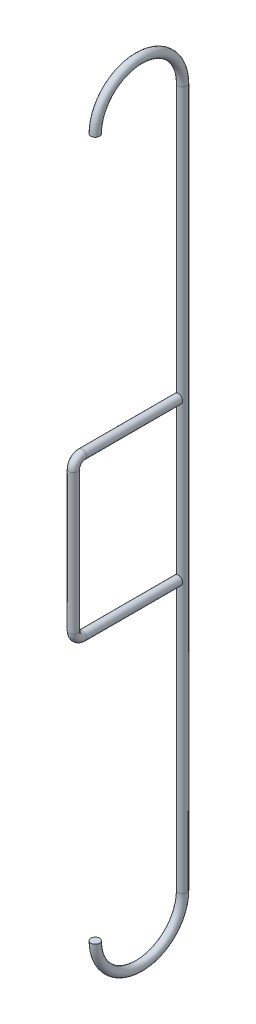
ISO-10303-21;
HEADER;
FILE_DESCRIPTION(('STEP AP214'),'2;1');
FILE_NAME('part.step','',(''),(''),'','','');
FILE_SCHEMA(('AUTOMOTIVE_DESIGN { 1 0 10303 214 1 1 1 1 }'));
ENDSEC;
DATA;
#1=APPLICATION_CONTEXT('core data for automotive mechanical design processes');
#2=APPLICATION_PROTOCOL_DEFINITION('international standard','automotive_design',2000,#1);
#3=PRODUCT_CONTEXT('',#1,'mechanical');
#4=PRODUCT('Part','Part','',(#3));
#5=PRODUCT_RELATED_PRODUCT_CATEGORY('part','',(#4));
#6=PRODUCT_DEFINITION_FORMATION('','',#4);
#7=PRODUCT_DEFINITION_CONTEXT('part definition',#1,'design');
#8=PRODUCT_DEFINITION('design','',#6,#7);
#9=PRODUCT_DEFINITION_SHAPE('','',#8);
#10=(LENGTH_UNIT() NAMED_UNIT(*) SI_UNIT(.MILLI.,.METRE.));
#11=(NAMED_UNIT(*) PLANE_ANGLE_UNIT() SI_UNIT($,.RADIAN.));
#12=(NAMED_UNIT(*) SI_UNIT($,.STERADIAN.) SOLID_ANGLE_UNIT());
#13=UNCERTAINTY_MEASURE_WITH_UNIT(LENGTH_MEASURE(1.E-05),#10,'distance_accuracy_value','');
#14=(GEOMETRIC_REPRESENTATION_CONTEXT(3) GLOBAL_UNCERTAINTY_ASSIGNED_CONTEXT((#13)) GLOBAL_UNIT_ASSIGNED_CONTEXT((#10,
#11,#12)) REPRESENTATION_CONTEXT('',''));
#15=CARTESIAN_POINT('',(0.,0.,0.));
#16=DIRECTION('',(0.,0.,1.));
#17=DIRECTION('',(1.,0.,0.));
#18=AXIS2_PLACEMENT_3D('',#15,#16,#17);
#19=CARTESIAN_POINT('',(0.,-57.15,-28.575));
#20=DIRECTION('',(0.,0.,-1.));
#21=DIRECTION('',(1.,0.,0.));
#22=AXIS2_PLACEMENT_3D('',#19,#20,#21);
#23=PLANE('',#22);
#24=CARTESIAN_POINT('',(0.,-57.15,-28.575));
#25=DIRECTION('',(0.,0.,-1.));
#26=DIRECTION('',(1.,0.,0.));
#27=AXIS2_PLACEMENT_3D('',#24,#25,#26);
#28=CIRCLE('',#27,3.175);
#29=CARTESIAN_POINT('',(3.175,-57.15,-28.575));
#30=VERTEX_POINT('',#29);
#31=EDGE_CURVE('E64',#30,#30,#28,.T.);
#32=ORIENTED_EDGE('',*,*,#31,.T.);
#33=EDGE_LOOP('',(#32));
#34=FACE_BOUND('',#33,.T.);
#35=ADVANCED_FACE('F42',(#34),#23,.T.);
#36=CARTESIAN_POINT('',(0.,57.15,-28.575));
#37=DIRECTION('',(0.,0.,1.));
#38=DIRECTION('',(1.,0.,0.));
#39=AXIS2_PLACEMENT_3D('',#36,#37,#38);
#40=PLANE('',#39);
#41=CARTESIAN_POINT('',(0.,57.15,-28.575));
#42=DIRECTION('',(0.,0.,1.));
#43=DIRECTION('',(1.,0.,0.));
#44=AXIS2_PLACEMENT_3D('',#41,#42,#43);
#45=CIRCLE('',#44,3.175);
#46=CARTESIAN_POINT('',(3.175,57.15,-28.575));
#47=VERTEX_POINT('',#46);
#48=EDGE_CURVE('E11',#47,#47,#45,.T.);
#49=ORIENTED_EDGE('',*,*,#48,.F.);
#50=EDGE_LOOP('',(#49));
#51=FACE_BOUND('',#50,.T.);
#52=ADVANCED_FACE('F72',(#51),#40,.F.);
#53=CARTESIAN_POINT('',(0.,-57.15,-28.575));
#54=DIRECTION('',(0.,0.,1.));
#55=DIRECTION('',(0.,-1.,0.));
#56=AXIS2_PLACEMENT_3D('',#53,#54,#55);
#57=CYLINDRICAL_SURFACE('',#56,3.175);
#58=CARTESIAN_POINT('',(0.,-57.15,41.275));
#59=DIRECTION('',(0.,0.,-1.));
#60=DIRECTION('',(1.,0.,0.));
#61=AXIS2_PLACEMENT_3D('',#58,#59,#60);
#62=CIRCLE('',#61,3.175);
#63=CARTESIAN_POINT('',(0.,-60.325,41.275));
#64=VERTEX_POINT('',#63);
#65=EDGE_CURVE('E61',#64,#64,#62,.T.);
#66=ORIENTED_EDGE('',*,*,#65,.T.);
#67=EDGE_LOOP('',(#66));
#68=FACE_BOUND('',#67,.T.);
#69=ORIENTED_EDGE('',*,*,#31,.F.);
#70=EDGE_LOOP('',(#69));
#71=FACE_BOUND('',#70,.T.);
#72=ADVANCED_FACE('F69',(#68,#71),#57,.T.);
#73=CARTESIAN_POINT('',(0.,-50.8,41.275));
#74=DIRECTION('',(-1.,0.,0.));
#75=DIRECTION('',(0.,0.,1.));
#76=AXIS2_PLACEMENT_3D('',#73,#74,#75);
#77=TOROIDAL_SURFACE('',#76,6.34999999999999,3.175);
#78=CARTESIAN_POINT('',(0.,-50.8,47.625));
#79=DIRECTION('',(0.,-1.,0.));
#80=DIRECTION('',(1.,0.,0.));
#81=AXIS2_PLACEMENT_3D('',#78,#79,#80);
#82=CIRCLE('',#81,3.175);
#83=CARTESIAN_POINT('',(0.,-50.8,50.8));
#84=VERTEX_POINT('',#83);
#85=EDGE_CURVE('E56',#84,#84,#82,.T.);
#86=CARTESIAN_POINT('',(0.,-50.8,41.275));
#87=DIRECTION('',(-1.,0.,0.));
#88=DIRECTION('',(0.,0.,1.));
#89=AXIS2_PLACEMENT_3D('',#86,#87,#88);
#90=CIRCLE('',#89,9.52499999999999);
#91=EDGE_CURVE('',#64,#84,#90,.T.);
#92=ORIENTED_EDGE('',*,*,#65,.F.);
#93=ORIENTED_EDGE('',*,*,#85,.T.);
#94=ORIENTED_EDGE('',*,*,#91,.T.);
#95=ORIENTED_EDGE('',*,*,#91,.F.);
#96=EDGE_LOOP('',(#92,#94,#93,#95));
#97=FACE_BOUND('',#96,.T.);
#98=ADVANCED_FACE('F71',(#97),#77,.T.);
#99=CARTESIAN_POINT('',(0.,-50.8,47.625));
#100=DIRECTION('',(0.,1.,0.));
#101=DIRECTION('',(0.,0.,1.));
#102=AXIS2_PLACEMENT_3D('',#99,#100,#101);
#103=CYLINDRICAL_SURFACE('',#102,3.175);
#104=CARTESIAN_POINT('',(0.,50.8,47.625));
#105=DIRECTION('',(0.,-1.,0.));
#106=DIRECTION('',(1.,0.,0.));
#107=AXIS2_PLACEMENT_3D('',#104,#105,#106);
#108=CIRCLE('',#107,3.175);
#109=CARTESIAN_POINT('',(0.,50.8,50.8));
#110=VERTEX_POINT('',#109);
#111=EDGE_CURVE('E52',#110,#110,#108,.T.);
#112=ORIENTED_EDGE('',*,*,#111,.T.);
#113=EDGE_LOOP('',(#112));
#114=FACE_BOUND('',#113,.T.);
#115=ORIENTED_EDGE('',*,*,#85,.F.);
#116=EDGE_LOOP('',(#115));
#117=FACE_BOUND('',#116,.T.);
#118=ADVANCED_FACE('F79',(#114,#117),#103,.T.);
#119=CARTESIAN_POINT('',(0.,50.8,41.275));
#120=DIRECTION('',(-1.,0.,0.));
#121=DIRECTION('',(0.,0.,1.));
#122=AXIS2_PLACEMENT_3D('',#119,#120,#121);
#123=TOROIDAL_SURFACE('',#122,6.35,3.175);
#124=CARTESIAN_POINT('',(0.,57.15,41.2749999999999));
#125=DIRECTION('',(0.,0.,1.));
#126=DIRECTION('',(1.,0.,0.));
#127=AXIS2_PLACEMENT_3D('',#124,#125,#126);
#128=CIRCLE('',#127,3.175);
#129=CARTESIAN_POINT('',(0.,60.325,41.2749999999999));
#130=VERTEX_POINT('',#129);
#131=EDGE_CURVE('E48',#130,#130,#128,.T.);
#132=CARTESIAN_POINT('',(0.,50.8,41.275));
#133=DIRECTION('',(-1.,0.,0.));
#134=DIRECTION('',(0.,0.,1.));
#135=AXIS2_PLACEMENT_3D('',#132,#133,#134);
#136=CIRCLE('',#135,9.525);
#137=EDGE_CURVE('',#110,#130,#136,.T.);
#138=ORIENTED_EDGE('',*,*,#111,.F.);
#139=ORIENTED_EDGE('',*,*,#131,.T.);
#140=ORIENTED_EDGE('',*,*,#137,.T.);
#141=ORIENTED_EDGE('',*,*,#137,.F.);
#142=EDGE_LOOP('',(#138,#140,#139,#141));
#143=FACE_BOUND('',#142,.T.);
#144=ADVANCED_FACE('F85',(#143),#123,.T.);
#145=CARTESIAN_POINT('',(0.,57.15,41.275));
#146=DIRECTION('',(0.,0.,-1.));
#147=DIRECTION('',(0.,1.,0.));
#148=AXIS2_PLACEMENT_3D('',#145,#146,#147);
#149=CYLINDRICAL_SURFACE('',#148,3.175);
#150=ORIENTED_EDGE('',*,*,#48,.T.);
#151=EDGE_LOOP('',(#150));
#152=FACE_BOUND('',#151,.T.);
#153=ORIENTED_EDGE('',*,*,#131,.F.);
#154=EDGE_LOOP('',(#153));
#155=FACE_BOUND('',#154,.T.);
#156=ADVANCED_FACE('F83',(#152,#155),#149,.T.);
#157=CLOSED_SHELL('',(#35,#52,#72,#98,#118,#144,#156));
#158=MANIFOLD_SOLID_BREP('B2',#157);
#159=CARTESIAN_POINT('',(0.,254.,31.75));
#160=DIRECTION('',(0.,1.,0.));
#161=DIRECTION('',(0.,0.,1.));
#162=AXIS2_PLACEMENT_3D('',#159,#160,#161);
#163=PLANE('',#162);
#164=CARTESIAN_POINT('',(0.,254.,31.75));
#165=DIRECTION('',(0.,1.,0.));
#166=DIRECTION('',(0.,0.,1.));
#167=AXIS2_PLACEMENT_3D('',#164,#165,#166);
#168=CIRCLE('',#167,3.175);
#169=CARTESIAN_POINT('',(0.,254.,34.925));
#170=VERTEX_POINT('',#169);
#171=EDGE_CURVE('E156',#170,#170,#168,.T.);
#172=ORIENTED_EDGE('',*,*,#171,.F.);
#173=EDGE_LOOP('',(#172));
#174=FACE_BOUND('',#173,.T.);
#175=ADVANCED_FACE('F142',(#174),#163,.F.);
#176=CARTESIAN_POINT('',(0.,-254.,31.75));
#177=DIRECTION('',(0.,1.,0.));
#178=DIRECTION('',(0.,0.,1.));
#179=AXIS2_PLACEMENT_3D('',#176,#177,#178);
#180=PLANE('',#179);
#181=CARTESIAN_POINT('',(0.,-254.,31.75));
#182=DIRECTION('',(0.,1.,0.));
#183=DIRECTION('',(0.,0.,1.));
#184=AXIS2_PLACEMENT_3D('',#181,#182,#183);
#185=CIRCLE('',#184,3.175);
#186=CARTESIAN_POINT('',(0.,-254.,34.925));
#187=VERTEX_POINT('',#186);
#188=EDGE_CURVE('E41',#187,#187,#185,.T.);
#189=ORIENTED_EDGE('',*,*,#188,.T.);
#190=EDGE_LOOP('',(#189));
#191=FACE_BOUND('',#190,.T.);
#192=ADVANCED_FACE('F165',(#191),#180,.T.);
#193=CARTESIAN_POINT('',(0.,254.,0.));
#194=DIRECTION('',(-1.,0.,0.));
#195=DIRECTION('',(0.,0.,1.));
#196=AXIS2_PLACEMENT_3D('',#193,#194,#195);
#197=TOROIDAL_SURFACE('',#196,31.75,3.175);
#198=CARTESIAN_POINT('',(0.,254.,-31.75));
#199=DIRECTION('',(0.,-1.,0.));
#200=DIRECTION('',(0.,0.,-1.));
#201=AXIS2_PLACEMENT_3D('',#198,#199,#200);
#202=CIRCLE('',#201,3.175);
#203=CARTESIAN_POINT('',(0.,254.,-34.925));
#204=VERTEX_POINT('',#203);
#205=EDGE_CURVE('E152',#204,#204,#202,.T.);
#206=CARTESIAN_POINT('',(0.,254.,0.));
#207=DIRECTION('',(-1.,0.,0.));
#208=DIRECTION('',(0.,0.,1.));
#209=AXIS2_PLACEMENT_3D('',#206,#207,#208);
#210=CIRCLE('',#209,34.925);
#211=EDGE_CURVE('',#170,#204,#210,.T.);
#212=ORIENTED_EDGE('',*,*,#171,.T.);
#213=ORIENTED_EDGE('',*,*,#205,.F.);
#214=ORIENTED_EDGE('',*,*,#211,.T.);
#215=ORIENTED_EDGE('',*,*,#211,.F.);
#216=EDGE_LOOP('',(#212,#214,#213,#215));
#217=FACE_BOUND('',#216,.T.);
#218=ADVANCED_FACE('F162',(#217),#197,.T.);
#219=CARTESIAN_POINT('',(0.,254.,-31.75));
#220=DIRECTION('',(0.,-1.,0.));
#221=DIRECTION('',(0.,0.,-1.));
#222=AXIS2_PLACEMENT_3D('',#219,#220,#221);
#223=CYLINDRICAL_SURFACE('',#222,3.175);
#224=CARTESIAN_POINT('',(0.,-254.,-31.75));
#225=DIRECTION('',(0.,-1.,0.));
#226=DIRECTION('',(0.,0.,-1.));
#227=AXIS2_PLACEMENT_3D('',#224,#225,#226);
#228=CIRCLE('',#227,3.175);
#229=CARTESIAN_POINT('',(0.,-254.,-34.925));
#230=VERTEX_POINT('',#229);
#231=EDGE_CURVE('E148',#230,#230,#228,.T.);
#232=ORIENTED_EDGE('',*,*,#231,.F.);
#233=EDGE_LOOP('',(#232));
#234=FACE_BOUND('',#233,.T.);
#235=ORIENTED_EDGE('',*,*,#205,.T.);
#236=EDGE_LOOP('',(#235));
#237=FACE_BOUND('',#236,.T.);
#238=ADVANCED_FACE('F171',(#234,#237),#223,.T.);
#239=CARTESIAN_POINT('',(0.,-254.,0.));
#240=DIRECTION('',(-1.,0.,0.));
#241=DIRECTION('',(0.,0.,1.));
#242=AXIS2_PLACEMENT_3D('',#239,#240,#241);
#243=TOROIDAL_SURFACE('',#242,31.75,3.175);
#244=CARTESIAN_POINT('',(0.,-254.,0.));
#245=DIRECTION('',(-1.,0.,0.));
#246=DIRECTION('',(0.,0.,1.));
#247=AXIS2_PLACEMENT_3D('',#244,#245,#246);
#248=CIRCLE('',#247,34.925);
#249=EDGE_CURVE('',#230,#187,#248,.T.);
#250=ORIENTED_EDGE('',*,*,#231,.T.);
#251=ORIENTED_EDGE('',*,*,#188,.F.);
#252=ORIENTED_EDGE('',*,*,#249,.T.);
#253=ORIENTED_EDGE('',*,*,#249,.F.);
#254=EDGE_LOOP('',(#250,#252,#251,#253));
#255=FACE_BOUND('',#254,.T.);
#256=ADVANCED_FACE('F169',(#255),#243,.T.);
#257=CLOSED_SHELL('',(#175,#192,#218,#238,#256));
#258=MANIFOLD_SOLID_BREP('B6',#257);
#259=ADVANCED_BREP_SHAPE_REPRESENTATION('',(#18,#158,#258),#14);
#260=SHAPE_DEFINITION_REPRESENTATION(#9,#259);
ENDSEC;
END-ISO-10303-21;
